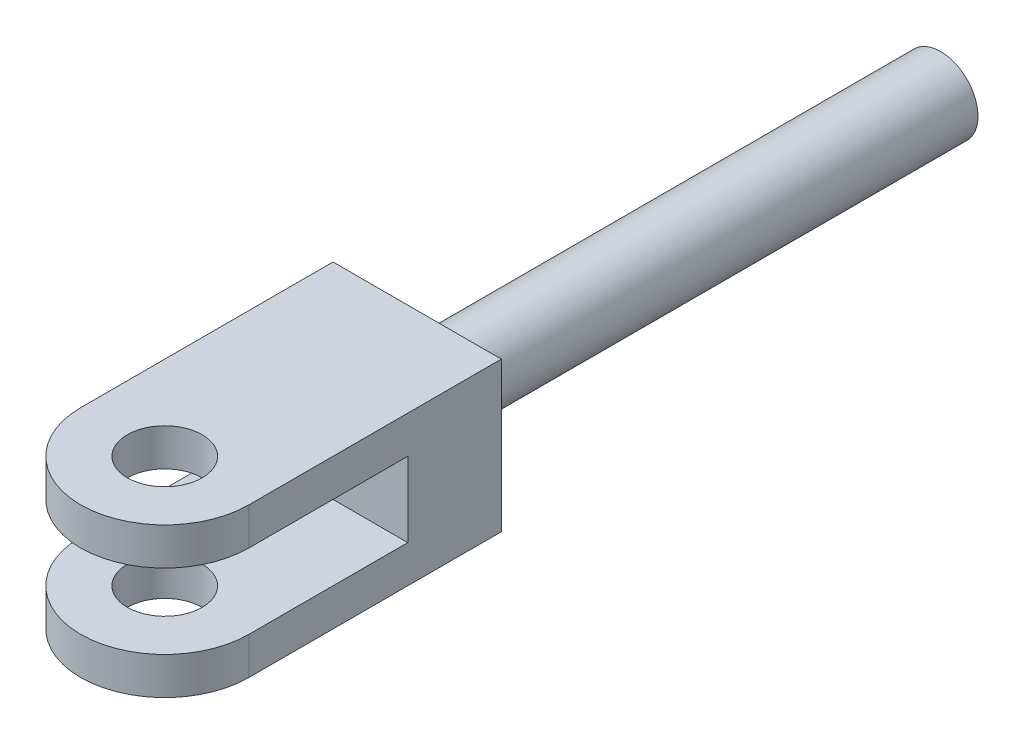
ISO-10303-21;
HEADER;
FILE_DESCRIPTION(('STEP AP214'),'2;1');
FILE_NAME('part.step','',(''),(''),'','','');
FILE_SCHEMA(('AUTOMOTIVE_DESIGN { 1 0 10303 214 1 1 1 1 }'));
ENDSEC;
DATA;
#1=APPLICATION_CONTEXT('core data for automotive mechanical design processes');
#2=APPLICATION_PROTOCOL_DEFINITION('international standard','automotive_design',2000,#1);
#3=PRODUCT_CONTEXT('',#1,'mechanical');
#4=PRODUCT('Part','Part','',(#3));
#5=PRODUCT_RELATED_PRODUCT_CATEGORY('part','',(#4));
#6=PRODUCT_DEFINITION_FORMATION('','',#4);
#7=PRODUCT_DEFINITION_CONTEXT('part definition',#1,'design');
#8=PRODUCT_DEFINITION('design','',#6,#7);
#9=PRODUCT_DEFINITION_SHAPE('','',#8);
#10=(LENGTH_UNIT() NAMED_UNIT(*) SI_UNIT(.MILLI.,.METRE.));
#11=(NAMED_UNIT(*) PLANE_ANGLE_UNIT() SI_UNIT($,.RADIAN.));
#12=(NAMED_UNIT(*) SI_UNIT($,.STERADIAN.) SOLID_ANGLE_UNIT());
#13=UNCERTAINTY_MEASURE_WITH_UNIT(LENGTH_MEASURE(1.E-05),#10,'distance_accuracy_value','');
#14=(GEOMETRIC_REPRESENTATION_CONTEXT(3) GLOBAL_UNCERTAINTY_ASSIGNED_CONTEXT((#13)) GLOBAL_UNIT_ASSIGNED_CONTEXT((#10,
#11,#12)) REPRESENTATION_CONTEXT('',''));
#15=CARTESIAN_POINT('',(0.,0.,0.));
#16=DIRECTION('',(0.,0.,1.));
#17=DIRECTION('',(1.,0.,0.));
#18=AXIS2_PLACEMENT_3D('',#15,#16,#17);
#19=CARTESIAN_POINT('',(28.575,-25.4,177.8));
#20=DIRECTION('',(1.,0.,0.));
#21=DIRECTION('',(0.,0.,-1.));
#22=AXIS2_PLACEMENT_3D('',#19,#20,#21);
#23=PLANE('',#22);
#24=DIRECTION('',(0.,0.,1.));
#25=VECTOR('',#24,1.);
#26=CARTESIAN_POINT('',(28.575,25.4,177.8));
#27=LINE('',#26,#25);
#28=CARTESIAN_POINT('',(28.575,25.4,177.8));
#29=VERTEX_POINT('',#28);
#30=CARTESIAN_POINT('',(28.575,25.3999999999999,263.525));
#31=VERTEX_POINT('',#30);
#32=EDGE_CURVE('E100',#29,#31,#27,.T.);
#33=ORIENTED_EDGE('',*,*,#32,.T.);
#34=DIRECTION('',(0.,1.,0.));
#35=VECTOR('',#34,1.);
#36=CARTESIAN_POINT('',(28.575,-25.4000000000001,263.525));
#37=LINE('',#36,#35);
#38=CARTESIAN_POINT('',(28.575,12.7,263.525));
#39=VERTEX_POINT('',#38);
#40=EDGE_CURVE('E106',#39,#31,#37,.T.);
#41=ORIENTED_EDGE('',*,*,#40,.F.);
#42=DIRECTION('',(0.,0.,-1.));
#43=VECTOR('',#42,1.);
#44=CARTESIAN_POINT('',(28.575,12.7,292.1));
#45=LINE('',#44,#43);
#46=CARTESIAN_POINT('',(28.575,12.7,209.55));
#47=VERTEX_POINT('',#46);
#48=EDGE_CURVE('E118',#39,#47,#45,.T.);
#49=ORIENTED_EDGE('',*,*,#48,.T.);
#50=DIRECTION('',(0.,-1.,0.));
#51=VECTOR('',#50,1.);
#52=CARTESIAN_POINT('',(28.575,12.7,209.55));
#53=LINE('',#52,#51);
#54=CARTESIAN_POINT('',(28.575,-12.7,209.55));
#55=VERTEX_POINT('',#54);
#56=EDGE_CURVE('E120',#47,#55,#53,.T.);
#57=ORIENTED_EDGE('',*,*,#56,.T.);
#58=DIRECTION('',(0.,0.,1.));
#59=VECTOR('',#58,1.);
#60=CARTESIAN_POINT('',(28.575,-12.7,209.55));
#61=LINE('',#60,#59);
#62=CARTESIAN_POINT('',(28.575,-12.7,263.525));
#63=VERTEX_POINT('',#62);
#64=EDGE_CURVE('E127',#55,#63,#61,.T.);
#65=ORIENTED_EDGE('',*,*,#64,.T.);
#66=CARTESIAN_POINT('',(28.575,-25.4000000000001,263.525));
#67=VERTEX_POINT('',#66);
#68=EDGE_CURVE('E112',#67,#63,#37,.T.);
#69=ORIENTED_EDGE('',*,*,#68,.F.);
#70=DIRECTION('',(0.,0.,-1.));
#71=VECTOR('',#70,1.);
#72=CARTESIAN_POINT('',(28.575,-25.4,292.1));
#73=LINE('',#72,#71);
#74=CARTESIAN_POINT('',(28.575,-25.4,177.8));
#75=VERTEX_POINT('',#74);
#76=EDGE_CURVE('E122',#67,#75,#73,.T.);
#77=ORIENTED_EDGE('',*,*,#76,.T.);
#78=DIRECTION('',(0.,1.,0.));
#79=VECTOR('',#78,1.);
#80=CARTESIAN_POINT('',(28.575,-25.4,177.8));
#81=LINE('',#80,#79);
#82=EDGE_CURVE('E116',#75,#29,#81,.T.);
#83=ORIENTED_EDGE('',*,*,#82,.T.);
#84=EDGE_LOOP('',(#33,#41,#49,#57,#65,#69,#77,#83));
#85=FACE_BOUND('',#84,.T.);
#86=ADVANCED_FACE('F33',(#85),#23,.T.);
#87=CARTESIAN_POINT('',(-28.575,-25.4,177.8));
#88=DIRECTION('',(1.,0.,0.));
#89=DIRECTION('',(0.,0.,-1.));
#90=AXIS2_PLACEMENT_3D('',#87,#88,#89);
#91=PLANE('',#90);
#92=DIRECTION('',(0.,1.,0.));
#93=VECTOR('',#92,1.);
#94=CARTESIAN_POINT('',(-28.575,-25.4000000000001,263.525));
#95=LINE('',#94,#93);
#96=CARTESIAN_POINT('',(-28.575,25.4,263.525));
#97=VERTEX_POINT('',#96);
#98=CARTESIAN_POINT('',(-28.575,12.7,263.525));
#99=VERTEX_POINT('',#98);
#100=EDGE_CURVE('E11',#97,#99,#95,.F.);
#101=ORIENTED_EDGE('',*,*,#100,.F.);
#102=DIRECTION('',(0.,0.,1.));
#103=VECTOR('',#102,1.);
#104=CARTESIAN_POINT('',(-28.575,25.4,177.8));
#105=LINE('',#104,#103);
#106=CARTESIAN_POINT('',(-28.575,25.4,177.8));
#107=VERTEX_POINT('',#106);
#108=EDGE_CURVE('E102',#107,#97,#105,.T.);
#109=ORIENTED_EDGE('',*,*,#108,.F.);
#110=DIRECTION('',(0.,1.,0.));
#111=VECTOR('',#110,1.);
#112=CARTESIAN_POINT('',(-28.575,-25.4,177.8));
#113=LINE('',#112,#111);
#114=CARTESIAN_POINT('',(-28.575,-25.4,177.8));
#115=VERTEX_POINT('',#114);
#116=EDGE_CURVE('E164',#115,#107,#113,.T.);
#117=ORIENTED_EDGE('',*,*,#116,.F.);
#118=DIRECTION('',(0.,0.,-1.));
#119=VECTOR('',#118,1.);
#120=CARTESIAN_POINT('',(-28.575,-25.4,292.1));
#121=LINE('',#120,#119);
#122=CARTESIAN_POINT('',(-28.575,-25.4000000000001,263.525));
#123=VERTEX_POINT('',#122);
#124=EDGE_CURVE('E152',#123,#115,#121,.T.);
#125=ORIENTED_EDGE('',*,*,#124,.F.);
#126=DIRECTION('',(0.,1.,0.));
#127=VECTOR('',#126,1.);
#128=CARTESIAN_POINT('',(-28.575,-25.4000000000001,263.525));
#129=LINE('',#128,#127);
#130=CARTESIAN_POINT('',(-28.575,-12.7,263.525));
#131=VERTEX_POINT('',#130);
#132=EDGE_CURVE('E113',#123,#131,#129,.T.);
#133=ORIENTED_EDGE('',*,*,#132,.T.);
#134=DIRECTION('',(0.,0.,1.));
#135=VECTOR('',#134,1.);
#136=CARTESIAN_POINT('',(-28.575,-12.7,209.55));
#137=LINE('',#136,#135);
#138=CARTESIAN_POINT('',(-28.575,-12.7,209.55));
#139=VERTEX_POINT('',#138);
#140=EDGE_CURVE('E171',#139,#131,#137,.T.);
#141=ORIENTED_EDGE('',*,*,#140,.F.);
#142=DIRECTION('',(0.,-1.,0.));
#143=VECTOR('',#142,1.);
#144=CARTESIAN_POINT('',(-28.575,12.7,209.55));
#145=LINE('',#144,#143);
#146=CARTESIAN_POINT('',(-28.575,12.7,209.55));
#147=VERTEX_POINT('',#146);
#148=EDGE_CURVE('E169',#147,#139,#145,.T.);
#149=ORIENTED_EDGE('',*,*,#148,.F.);
#150=DIRECTION('',(0.,0.,-1.));
#151=VECTOR('',#150,1.);
#152=CARTESIAN_POINT('',(-28.575,12.7,292.1));
#153=LINE('',#152,#151);
#154=EDGE_CURVE('E167',#99,#147,#153,.T.);
#155=ORIENTED_EDGE('',*,*,#154,.F.);
#156=EDGE_LOOP('',(#101,#109,#117,#125,#133,#141,#149,#155));
#157=FACE_BOUND('',#156,.T.);
#158=ADVANCED_FACE('F185',(#157),#91,.F.);
#159=CARTESIAN_POINT('',(0.,0.,177.8));
#160=DIRECTION('',(0.,0.,-1.));
#161=DIRECTION('',(-1.,0.,0.));
#162=AXIS2_PLACEMENT_3D('',#159,#160,#161);
#163=CYLINDRICAL_SURFACE('',#162,12.7);
#164=CARTESIAN_POINT('',(0.,0.,177.8));
#165=DIRECTION('',(0.,0.,1.));
#166=DIRECTION('',(1.,0.,0.));
#167=AXIS2_PLACEMENT_3D('',#164,#165,#166);
#168=CIRCLE('',#167,12.7);
#169=CARTESIAN_POINT('',(12.7,0.,177.8));
#170=VERTEX_POINT('',#169);
#171=EDGE_CURVE('E41',#170,#170,#168,.T.);
#172=ORIENTED_EDGE('',*,*,#171,.F.);
#173=EDGE_LOOP('',(#172));
#174=FACE_BOUND('',#173,.T.);
#175=CARTESIAN_POINT('',(0.,0.,0.));
#176=DIRECTION('',(0.,0.,1.));
#177=DIRECTION('',(1.,0.,0.));
#178=AXIS2_PLACEMENT_3D('',#175,#176,#177);
#179=CIRCLE('',#178,12.7);
#180=CARTESIAN_POINT('',(12.7,0.,0.));
#181=VERTEX_POINT('',#180);
#182=EDGE_CURVE('E141',#181,#181,#179,.T.);
#183=ORIENTED_EDGE('',*,*,#182,.T.);
#184=EDGE_LOOP('',(#183));
#185=FACE_BOUND('',#184,.T.);
#186=ADVANCED_FACE('F35',(#174,#185),#163,.T.);
#187=CARTESIAN_POINT('',(0.,0.,0.));
#188=DIRECTION('',(0.,0.,1.));
#189=DIRECTION('',(1.,0.,0.));
#190=AXIS2_PLACEMENT_3D('',#187,#188,#189);
#191=PLANE('',#190);
#192=ORIENTED_EDGE('',*,*,#182,.F.);
#193=EDGE_LOOP('',(#192));
#194=FACE_BOUND('',#193,.T.);
#195=ADVANCED_FACE('F280',(#194),#191,.F.);
#196=CARTESIAN_POINT('',(28.575,-25.4,177.8));
#197=DIRECTION('',(0.,0.,1.));
#198=DIRECTION('',(1.,0.,0.));
#199=AXIS2_PLACEMENT_3D('',#196,#197,#198);
#200=PLANE('',#199);
#201=ORIENTED_EDGE('',*,*,#116,.T.);
#202=DIRECTION('',(-1.,0.,0.));
#203=VECTOR('',#202,1.);
#204=CARTESIAN_POINT('',(28.575,25.4,177.8));
#205=LINE('',#204,#203);
#206=EDGE_CURVE('E136',#29,#107,#205,.T.);
#207=ORIENTED_EDGE('',*,*,#206,.F.);
#208=ORIENTED_EDGE('',*,*,#82,.F.);
#209=DIRECTION('',(-1.,0.,0.));
#210=VECTOR('',#209,1.);
#211=CARTESIAN_POINT('',(28.575,-25.4,177.8));
#212=LINE('',#211,#210);
#213=EDGE_CURVE('E138',#75,#115,#212,.T.);
#214=ORIENTED_EDGE('',*,*,#213,.T.);
#215=EDGE_LOOP('',(#201,#207,#208,#214));
#216=FACE_BOUND('',#215,.T.);
#217=ORIENTED_EDGE('',*,*,#171,.T.);
#218=EDGE_LOOP('',(#217));
#219=FACE_BOUND('',#218,.T.);
#220=ADVANCED_FACE('F179',(#216,#219),#200,.F.);
#221=CARTESIAN_POINT('',(28.575,-25.4,292.1));
#222=DIRECTION('',(0.,1.,0.));
#223=DIRECTION('',(0.,0.,1.));
#224=AXIS2_PLACEMENT_3D('',#221,#222,#223);
#225=PLANE('',#224);
#226=CARTESIAN_POINT('',(0.,-25.4000000000001,263.525));
#227=DIRECTION('',(0.,1.,0.));
#228=DIRECTION('',(0.,0.,1.));
#229=AXIS2_PLACEMENT_3D('',#226,#227,#228);
#230=CIRCLE('',#229,12.7);
#231=CARTESIAN_POINT('',(0.,-25.4000000000001,276.225));
#232=VERTEX_POINT('',#231);
#233=EDGE_CURVE('E148',#232,#232,#230,.T.);
#234=ORIENTED_EDGE('',*,*,#233,.T.);
#235=EDGE_LOOP('',(#234));
#236=FACE_BOUND('',#235,.T.);
#237=ORIENTED_EDGE('',*,*,#76,.F.);
#238=CARTESIAN_POINT('',(0.,-25.4000000000001,263.525));
#239=DIRECTION('',(0.,-1.,0.));
#240=DIRECTION('',(0.,0.,1.));
#241=AXIS2_PLACEMENT_3D('',#238,#239,#240);
#242=CIRCLE('',#241,28.575);
#243=EDGE_CURVE('E103',#67,#123,#242,.T.);
#244=ORIENTED_EDGE('',*,*,#243,.T.);
#245=ORIENTED_EDGE('',*,*,#124,.T.);
#246=ORIENTED_EDGE('',*,*,#213,.F.);
#247=EDGE_LOOP('',(#237,#244,#245,#246));
#248=FACE_BOUND('',#247,.T.);
#249=ADVANCED_FACE('F181',(#236,#248),#225,.F.);
#250=CARTESIAN_POINT('',(28.575,25.4,177.8));
#251=DIRECTION('',(0.,-1.,0.));
#252=DIRECTION('',(0.,0.,-1.));
#253=AXIS2_PLACEMENT_3D('',#250,#251,#252);
#254=PLANE('',#253);
#255=CARTESIAN_POINT('',(0.,25.3999999999999,263.525));
#256=DIRECTION('',(0.,1.,0.));
#257=DIRECTION('',(0.,0.,1.));
#258=AXIS2_PLACEMENT_3D('',#255,#256,#257);
#259=CIRCLE('',#258,12.7);
#260=CARTESIAN_POINT('',(0.,25.3999999999999,276.225));
#261=VERTEX_POINT('',#260);
#262=EDGE_CURVE('E155',#261,#261,#259,.T.);
#263=ORIENTED_EDGE('',*,*,#262,.F.);
#264=EDGE_LOOP('',(#263));
#265=FACE_BOUND('',#264,.T.);
#266=ORIENTED_EDGE('',*,*,#108,.T.);
#267=CARTESIAN_POINT('',(0.,25.3999999999999,263.525));
#268=DIRECTION('',(0.,-1.,0.));
#269=DIRECTION('',(0.,0.,1.));
#270=AXIS2_PLACEMENT_3D('',#267,#268,#269);
#271=CIRCLE('',#270,28.575);
#272=EDGE_CURVE('E47',#31,#97,#271,.T.);
#273=ORIENTED_EDGE('',*,*,#272,.F.);
#274=ORIENTED_EDGE('',*,*,#32,.F.);
#275=ORIENTED_EDGE('',*,*,#206,.T.);
#276=EDGE_LOOP('',(#266,#273,#274,#275));
#277=FACE_BOUND('',#276,.T.);
#278=ADVANCED_FACE('F97',(#265,#277),#254,.F.);
#279=CARTESIAN_POINT('',(28.575,12.7,292.1));
#280=DIRECTION('',(0.,1.,0.));
#281=DIRECTION('',(0.,0.,1.));
#282=AXIS2_PLACEMENT_3D('',#279,#280,#281);
#283=PLANE('',#282);
#284=CARTESIAN_POINT('',(0.,12.7,263.525));
#285=DIRECTION('',(0.,1.,0.));
#286=DIRECTION('',(0.,0.,1.));
#287=AXIS2_PLACEMENT_3D('',#284,#285,#286);
#288=CIRCLE('',#287,12.7);
#289=CARTESIAN_POINT('',(0.,12.7,276.225));
#290=VERTEX_POINT('',#289);
#291=EDGE_CURVE('E147',#290,#290,#288,.T.);
#292=ORIENTED_EDGE('',*,*,#291,.T.);
#293=EDGE_LOOP('',(#292));
#294=FACE_BOUND('',#293,.T.);
#295=ORIENTED_EDGE('',*,*,#48,.F.);
#296=CARTESIAN_POINT('',(0.,12.7,263.525));
#297=DIRECTION('',(0.,1.,0.));
#298=DIRECTION('',(0.,0.,1.));
#299=AXIS2_PLACEMENT_3D('',#296,#297,#298);
#300=CIRCLE('',#299,28.575);
#301=EDGE_CURVE('E109',#39,#99,#300,.F.);
#302=ORIENTED_EDGE('',*,*,#301,.T.);
#303=ORIENTED_EDGE('',*,*,#154,.T.);
#304=DIRECTION('',(-1.,0.,0.));
#305=VECTOR('',#304,1.);
#306=CARTESIAN_POINT('',(28.575,12.7,209.55));
#307=LINE('',#306,#305);
#308=EDGE_CURVE('E133',#47,#147,#307,.T.);
#309=ORIENTED_EDGE('',*,*,#308,.F.);
#310=EDGE_LOOP('',(#295,#302,#303,#309));
#311=FACE_BOUND('',#310,.T.);
#312=ADVANCED_FACE('F189',(#294,#311),#283,.F.);
#313=CARTESIAN_POINT('',(28.575,12.7,209.55));
#314=DIRECTION('',(0.,0.,-1.));
#315=DIRECTION('',(-1.,0.,0.));
#316=AXIS2_PLACEMENT_3D('',#313,#314,#315);
#317=PLANE('',#316);
#318=ORIENTED_EDGE('',*,*,#148,.T.);
#319=DIRECTION('',(-1.,0.,0.));
#320=VECTOR('',#319,1.);
#321=CARTESIAN_POINT('',(28.575,-12.7,209.55));
#322=LINE('',#321,#320);
#323=EDGE_CURVE('E130',#55,#139,#322,.T.);
#324=ORIENTED_EDGE('',*,*,#323,.F.);
#325=ORIENTED_EDGE('',*,*,#56,.F.);
#326=ORIENTED_EDGE('',*,*,#308,.T.);
#327=EDGE_LOOP('',(#318,#324,#325,#326));
#328=FACE_BOUND('',#327,.T.);
#329=ADVANCED_FACE('F202',(#328),#317,.F.);
#330=CARTESIAN_POINT('',(28.575,-12.7,209.55));
#331=DIRECTION('',(0.,-1.,0.));
#332=DIRECTION('',(0.,0.,-1.));
#333=AXIS2_PLACEMENT_3D('',#330,#331,#332);
#334=PLANE('',#333);
#335=CARTESIAN_POINT('',(0.,-12.7,263.525));
#336=DIRECTION('',(0.,-1.,0.));
#337=DIRECTION('',(0.,0.,-1.));
#338=AXIS2_PLACEMENT_3D('',#335,#336,#337);
#339=CIRCLE('',#338,12.7);
#340=CARTESIAN_POINT('',(0.,-12.7,276.225));
#341=VERTEX_POINT('',#340);
#342=EDGE_CURVE('E145',#341,#341,#339,.T.);
#343=ORIENTED_EDGE('',*,*,#342,.T.);
#344=EDGE_LOOP('',(#343));
#345=FACE_BOUND('',#344,.T.);
#346=ORIENTED_EDGE('',*,*,#140,.T.);
#347=CARTESIAN_POINT('',(0.,-12.7,263.525));
#348=DIRECTION('',(0.,-1.,0.));
#349=DIRECTION('',(0.,0.,-1.));
#350=AXIS2_PLACEMENT_3D('',#347,#348,#349);
#351=CIRCLE('',#350,28.575);
#352=EDGE_CURVE('E55',#131,#63,#351,.F.);
#353=ORIENTED_EDGE('',*,*,#352,.T.);
#354=ORIENTED_EDGE('',*,*,#64,.F.);
#355=ORIENTED_EDGE('',*,*,#323,.T.);
#356=EDGE_LOOP('',(#346,#353,#354,#355));
#357=FACE_BOUND('',#356,.T.);
#358=ADVANCED_FACE('F199',(#345,#357),#334,.F.);
#359=CARTESIAN_POINT('',(0.,-25.4000000000001,263.525));
#360=DIRECTION('',(0.,1.,0.));
#361=DIRECTION('',(0.,0.,1.));
#362=AXIS2_PLACEMENT_3D('',#359,#360,#361);
#363=CYLINDRICAL_SURFACE('',#362,12.7);
#364=CARTESIAN_POINT('',(0.,-25.4000000000001,276.225));
#365=CARTESIAN_POINT('',(0.,-25.2677083333334,276.225));
#366=CARTESIAN_POINT('',(0.,-25.1354166666668,276.225));
#367=CARTESIAN_POINT('',(0.,-24.8708333333334,276.225));
#368=CARTESIAN_POINT('',(0.,-24.7385416666668,276.225));
#369=CARTESIAN_POINT('',(0.,-24.4739583333334,276.225));
#370=CARTESIAN_POINT('',(0.,-24.3416666666668,276.225));
#371=CARTESIAN_POINT('',(0.,-24.0770833333334,276.225));
#372=CARTESIAN_POINT('',(0.,-23.9447916666667,276.225));
#373=CARTESIAN_POINT('',(0.,-23.6802083333334,276.225));
#374=CARTESIAN_POINT('',(0.,-23.5479166666667,276.225));
#375=CARTESIAN_POINT('',(0.,-23.2833333333334,276.225));
#376=CARTESIAN_POINT('',(0.,-23.1510416666667,276.225));
#377=CARTESIAN_POINT('',(0.,-22.8864583333334,276.225));
#378=CARTESIAN_POINT('',(0.,-22.7541666666667,276.225));
#379=CARTESIAN_POINT('',(0.,-22.4895833333334,276.225));
#380=CARTESIAN_POINT('',(0.,-22.3572916666667,276.225));
#381=CARTESIAN_POINT('',(0.,-22.0927083333334,276.225));
#382=CARTESIAN_POINT('',(0.,-21.9604166666667,276.225));
#383=CARTESIAN_POINT('',(0.,-21.6958333333334,276.225));
#384=CARTESIAN_POINT('',(0.,-21.5635416666667,276.225));
#385=CARTESIAN_POINT('',(0.,-21.2989583333334,276.225));
#386=CARTESIAN_POINT('',(0.,-21.1666666666667,276.225));
#387=CARTESIAN_POINT('',(0.,-20.9020833333334,276.225));
#388=CARTESIAN_POINT('',(0.,-20.7697916666667,276.225));
#389=CARTESIAN_POINT('',(0.,-20.5052083333334,276.225));
#390=CARTESIAN_POINT('',(0.,-20.3729166666667,276.225));
#391=CARTESIAN_POINT('',(0.,-20.1083333333334,276.225));
#392=CARTESIAN_POINT('',(0.,-19.9760416666667,276.225));
#393=CARTESIAN_POINT('',(0.,-19.7114583333334,276.225));
#394=CARTESIAN_POINT('',(0.,-19.5791666666667,276.225));
#395=CARTESIAN_POINT('',(0.,-19.3145833333334,276.225));
#396=CARTESIAN_POINT('',(0.,-19.1822916666667,276.225));
#397=CARTESIAN_POINT('',(0.,-18.9177083333334,276.225));
#398=CARTESIAN_POINT('',(0.,-18.7854166666667,276.225));
#399=CARTESIAN_POINT('',(0.,-18.5208333333334,276.225));
#400=CARTESIAN_POINT('',(0.,-18.3885416666667,276.225));
#401=CARTESIAN_POINT('',(0.,-18.1239583333334,276.225));
#402=CARTESIAN_POINT('',(0.,-17.9916666666667,276.225));
#403=CARTESIAN_POINT('',(0.,-17.7270833333334,276.225));
#404=CARTESIAN_POINT('',(0.,-17.5947916666667,276.225));
#405=CARTESIAN_POINT('',(0.,-17.3302083333334,276.225));
#406=CARTESIAN_POINT('',(0.,-17.1979166666667,276.225));
#407=CARTESIAN_POINT('',(0.,-16.9333333333334,276.225));
#408=CARTESIAN_POINT('',(0.,-16.8010416666667,276.225));
#409=CARTESIAN_POINT('',(0.,-16.5364583333334,276.225));
#410=CARTESIAN_POINT('',(0.,-16.4041666666667,276.225));
#411=CARTESIAN_POINT('',(0.,-16.1395833333334,276.225));
#412=CARTESIAN_POINT('',(0.,-16.0072916666667,276.225));
#413=CARTESIAN_POINT('',(0.,-15.7427083333334,276.225));
#414=CARTESIAN_POINT('',(0.,-15.6104166666667,276.225));
#415=CARTESIAN_POINT('',(0.,-15.3458333333334,276.225));
#416=CARTESIAN_POINT('',(0.,-15.2135416666667,276.225));
#417=CARTESIAN_POINT('',(0.,-14.9489583333334,276.225));
#418=CARTESIAN_POINT('',(0.,-14.8166666666667,276.225));
#419=CARTESIAN_POINT('',(0.,-14.5520833333334,276.225));
#420=CARTESIAN_POINT('',(0.,-14.4197916666667,276.225));
#421=CARTESIAN_POINT('',(0.,-14.1552083333334,276.225));
#422=CARTESIAN_POINT('',(0.,-14.0229166666667,276.225));
#423=CARTESIAN_POINT('',(0.,-13.7583333333334,276.225));
#424=CARTESIAN_POINT('',(0.,-13.6260416666667,276.225));
#425=CARTESIAN_POINT('',(0.,-13.3614583333334,276.225));
#426=CARTESIAN_POINT('',(0.,-13.2291666666667,276.225));
#427=CARTESIAN_POINT('',(0.,-12.9645833333334,276.225));
#428=CARTESIAN_POINT('',(0.,-12.8322916666667,276.225));
#429=CARTESIAN_POINT('',(0.,-12.7,276.225));
#430=B_SPLINE_CURVE_WITH_KNOTS('',3,(#364,#365,#366,#367,#368,#369,#370,#371,#372,#373,#374,
#375,#376,#377,#378,#379,#380,#381,#382,#383,#384,#385,#386,#387,#388,#389,#390,#391,#392,#393,
#394,#395,#396,#397,#398,#399,#400,#401,#402,#403,#404,#405,#406,#407,#408,#409,#410,#411,#412,
#413,#414,#415,#416,#417,#418,#419,#420,#421,#422,#423,#424,#425,#426,#427,#428,#429),
.UNSPECIFIED.,.F.,.F.,(4,2,2,2,2,2,2,2,2,2,2,2,2,2,2,2,2,2,2,2,2,2,2,2,2,2,2,2,2,2,2,2,4),(0.,
0.396875000000001,0.793750000000003,1.190625,1.58750000000001,1.98437500000001,2.38125000000001,
2.77812500000001,3.17500000000002,3.57187500000002,3.96875000000002,4.36562500000003,
4.76250000000003,5.15937500000003,5.55625000000003,5.95312500000003,6.35000000000004,
6.74687500000004,7.14375000000004,7.54062500000004,7.93750000000005,8.33437500000005,
8.73125000000005,9.12812500000005,9.52500000000005,9.92187500000006,10.3187500000001,
10.7156250000001,11.1125000000001,11.5093750000001,11.9062500000001,12.3031250000001,
12.7000000000001),.UNSPECIFIED.);
#431=EDGE_CURVE('BSEAM208',#232,#341,#430,.T.);
#432=ORIENTED_EDGE('',*,*,#233,.F.);
#433=ORIENTED_EDGE('',*,*,#342,.F.);
#434=ORIENTED_EDGE('',*,*,#431,.T.);
#435=ORIENTED_EDGE('',*,*,#431,.F.);
#436=EDGE_LOOP('',(#432,#434,#433,#435));
#437=FACE_BOUND('',#436,.T.);
#438=ADVANCED_FACE('F208',(#437),#363,.F.);
#439=CARTESIAN_POINT('',(0.,25.3999999999999,276.225));
#440=CARTESIAN_POINT('',(0.,25.2677083333332,276.225));
#441=CARTESIAN_POINT('',(0.,25.1354166666666,276.225));
#442=CARTESIAN_POINT('',(0.,24.8708333333332,276.225));
#443=CARTESIAN_POINT('',(0.,24.7385416666666,276.225));
#444=CARTESIAN_POINT('',(0.,24.4739583333333,276.225));
#445=CARTESIAN_POINT('',(0.,24.3416666666666,276.225));
#446=CARTESIAN_POINT('',(0.,24.0770833333333,276.225));
#447=CARTESIAN_POINT('',(0.,23.9447916666666,276.225));
#448=CARTESIAN_POINT('',(0.,23.6802083333333,276.225));
#449=CARTESIAN_POINT('',(0.,23.5479166666666,276.225));
#450=CARTESIAN_POINT('',(0.,23.2833333333333,276.225));
#451=CARTESIAN_POINT('',(0.,23.1510416666666,276.225));
#452=CARTESIAN_POINT('',(0.,22.8864583333333,276.225));
#453=CARTESIAN_POINT('',(0.,22.7541666666666,276.225));
#454=CARTESIAN_POINT('',(0.,22.4895833333333,276.225));
#455=CARTESIAN_POINT('',(0.,22.3572916666666,276.225));
#456=CARTESIAN_POINT('',(0.,22.0927083333333,276.225));
#457=CARTESIAN_POINT('',(0.,21.9604166666666,276.225));
#458=CARTESIAN_POINT('',(0.,21.6958333333333,276.225));
#459=CARTESIAN_POINT('',(0.,21.5635416666666,276.225));
#460=CARTESIAN_POINT('',(0.,21.2989583333333,276.225));
#461=CARTESIAN_POINT('',(0.,21.1666666666666,276.225));
#462=CARTESIAN_POINT('',(0.,20.9020833333333,276.225));
#463=CARTESIAN_POINT('',(0.,20.7697916666666,276.225));
#464=CARTESIAN_POINT('',(0.,20.5052083333333,276.225));
#465=CARTESIAN_POINT('',(0.,20.3729166666666,276.225));
#466=CARTESIAN_POINT('',(0.,20.1083333333333,276.225));
#467=CARTESIAN_POINT('',(0.,19.9760416666666,276.225));
#468=CARTESIAN_POINT('',(0.,19.7114583333333,276.225));
#469=CARTESIAN_POINT('',(0.,19.5791666666666,276.225));
#470=CARTESIAN_POINT('',(0.,19.3145833333333,276.225));
#471=CARTESIAN_POINT('',(0.,19.1822916666666,276.225));
#472=CARTESIAN_POINT('',(0.,18.9177083333333,276.225));
#473=CARTESIAN_POINT('',(0.,18.7854166666666,276.225));
#474=CARTESIAN_POINT('',(0.,18.5208333333333,276.225));
#475=CARTESIAN_POINT('',(0.,18.3885416666666,276.225));
#476=CARTESIAN_POINT('',(0.,18.1239583333333,276.225));
#477=CARTESIAN_POINT('',(0.,17.9916666666666,276.225));
#478=CARTESIAN_POINT('',(0.,17.7270833333333,276.225));
#479=CARTESIAN_POINT('',(0.,17.5947916666666,276.225));
#480=CARTESIAN_POINT('',(0.,17.3302083333333,276.225));
#481=CARTESIAN_POINT('',(0.,17.1979166666666,276.225));
#482=CARTESIAN_POINT('',(0.,16.9333333333333,276.225));
#483=CARTESIAN_POINT('',(0.,16.8010416666666,276.225));
#484=CARTESIAN_POINT('',(0.,16.5364583333333,276.225));
#485=CARTESIAN_POINT('',(0.,16.4041666666666,276.225));
#486=CARTESIAN_POINT('',(0.,16.1395833333333,276.225));
#487=CARTESIAN_POINT('',(0.,16.0072916666666,276.225));
#488=CARTESIAN_POINT('',(0.,15.7427083333333,276.225));
#489=CARTESIAN_POINT('',(0.,15.6104166666667,276.225));
#490=CARTESIAN_POINT('',(0.,15.3458333333333,276.225));
#491=CARTESIAN_POINT('',(0.,15.2135416666667,276.225));
#492=CARTESIAN_POINT('',(0.,14.9489583333333,276.225));
#493=CARTESIAN_POINT('',(0.,14.8166666666667,276.225));
#494=CARTESIAN_POINT('',(0.,14.5520833333333,276.225));
#495=CARTESIAN_POINT('',(0.,14.4197916666667,276.225));
#496=CARTESIAN_POINT('',(0.,14.1552083333333,276.225));
#497=CARTESIAN_POINT('',(0.,14.0229166666667,276.225));
#498=CARTESIAN_POINT('',(0.,13.7583333333333,276.225));
#499=CARTESIAN_POINT('',(0.,13.6260416666667,276.225));
#500=CARTESIAN_POINT('',(0.,13.3614583333333,276.225));
#501=CARTESIAN_POINT('',(0.,13.2291666666667,276.225));
#502=CARTESIAN_POINT('',(0.,12.9645833333333,276.225));
#503=CARTESIAN_POINT('',(0.,12.8322916666667,276.225));
#504=CARTESIAN_POINT('',(0.,12.7,276.225));
#505=B_SPLINE_CURVE_WITH_KNOTS('',3,(#439,#440,#441,#442,#443,#444,#445,#446,#447,#448,#449,
#450,#451,#452,#453,#454,#455,#456,#457,#458,#459,#460,#461,#462,#463,#464,#465,#466,#467,#468,
#469,#470,#471,#472,#473,#474,#475,#476,#477,#478,#479,#480,#481,#482,#483,#484,#485,#486,#487,
#488,#489,#490,#491,#492,#493,#494,#495,#496,#497,#498,#499,#500,#501,#502,#503,#504),
.UNSPECIFIED.,.F.,.F.,(4,2,2,2,2,2,2,2,2,2,2,2,2,2,2,2,2,2,2,2,2,2,2,2,2,2,2,2,2,2,2,2,4),(0.,
0.396874999999998,0.793749999999996,1.19062499999999,1.58749999999999,1.98437499999998,
2.38124999999998,2.77812499999998,3.17499999999998,3.57187499999997,3.96874999999997,
4.36562499999997,4.76249999999996,5.15937499999996,5.55624999999996,5.95312499999995,
6.34999999999995,6.74687499999995,7.14374999999995,7.54062499999995,7.93749999999994,
8.33437499999994,8.73124999999993,9.12812499999993,9.52499999999993,9.92187499999993,
10.3187499999999,10.7156249999999,11.1124999999999,11.5093749999999,11.9062499999999,
12.3031249999999,12.6999999999999),.UNSPECIFIED.);
#506=EDGE_CURVE('BSEAM218',#261,#290,#505,.T.);
#507=ORIENTED_EDGE('',*,*,#262,.T.);
#508=ORIENTED_EDGE('',*,*,#291,.F.);
#509=ORIENTED_EDGE('',*,*,#506,.T.);
#510=ORIENTED_EDGE('',*,*,#506,.F.);
#511=EDGE_LOOP('',(#507,#509,#508,#510));
#512=FACE_BOUND('',#511,.T.);
#513=ADVANCED_FACE('F218',(#512),#363,.F.);
#514=CARTESIAN_POINT('',(0.,-25.4000000000001,263.525));
#515=DIRECTION('',(0.,1.,0.));
#516=DIRECTION('',(0.,0.,1.));
#517=AXIS2_PLACEMENT_3D('',#514,#515,#516);
#518=CYLINDRICAL_SURFACE('',#517,28.575);
#519=ORIENTED_EDGE('',*,*,#132,.F.);
#520=ORIENTED_EDGE('',*,*,#243,.F.);
#521=ORIENTED_EDGE('',*,*,#68,.T.);
#522=ORIENTED_EDGE('',*,*,#352,.F.);
#523=EDGE_LOOP('',(#519,#520,#521,#522));
#524=FACE_BOUND('',#523,.T.);
#525=ADVANCED_FACE('F194',(#524),#518,.T.);
#526=ORIENTED_EDGE('',*,*,#272,.T.);
#527=ORIENTED_EDGE('',*,*,#100,.T.);
#528=ORIENTED_EDGE('',*,*,#301,.F.);
#529=ORIENTED_EDGE('',*,*,#40,.T.);
#530=EDGE_LOOP('',(#526,#527,#528,#529));
#531=FACE_BOUND('',#530,.T.);
#532=ADVANCED_FACE('F107',(#531),#518,.T.);
#533=CLOSED_SHELL('',(#86,#158,#186,#195,#220,#249,#278,#312,#329,#358,#438,#513,#525,#532));
#534=MANIFOLD_SOLID_BREP('B2',#533);
#535=ADVANCED_BREP_SHAPE_REPRESENTATION('',(#18,#534),#14);
#536=SHAPE_DEFINITION_REPRESENTATION(#9,#535);
ENDSEC;
END-ISO-10303-21;
